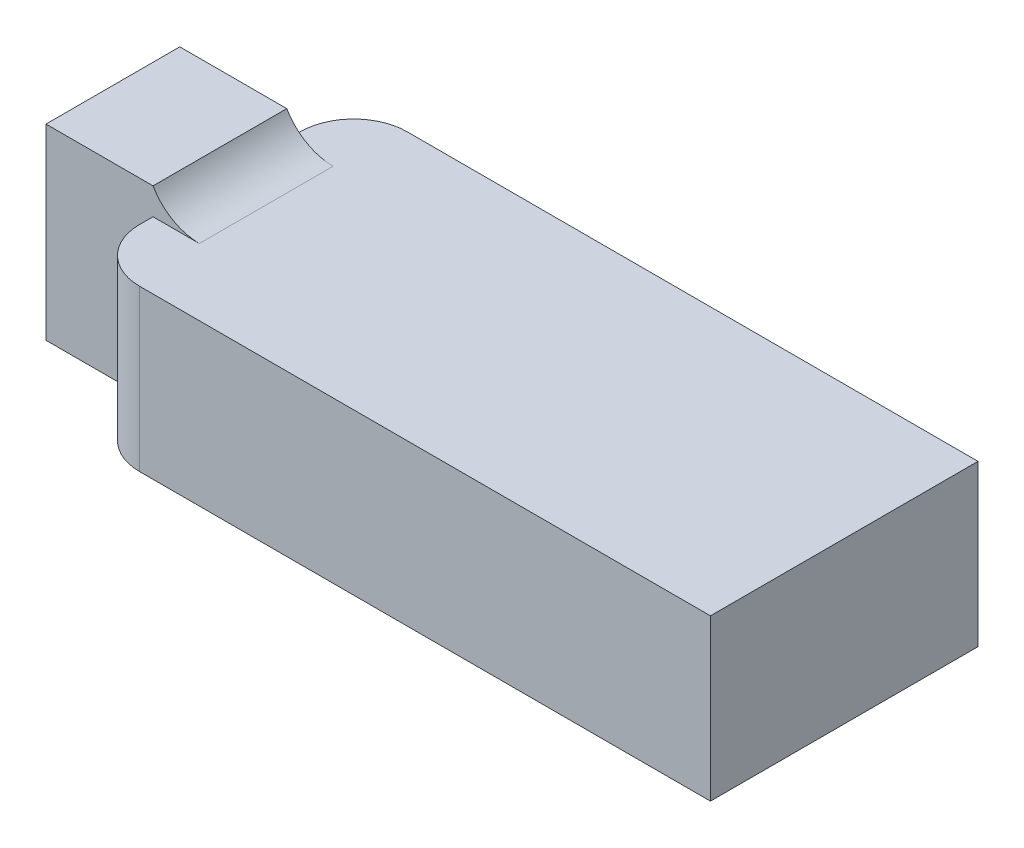
ISO-10303-21;
HEADER;
FILE_DESCRIPTION(('STEP AP214'),'2;1');
FILE_NAME('part.step','',(''),(''),'','','');
FILE_SCHEMA(('AUTOMOTIVE_DESIGN { 1 0 10303 214 1 1 1 1 }'));
ENDSEC;
DATA;
#1=APPLICATION_CONTEXT('core data for automotive mechanical design processes');
#2=APPLICATION_PROTOCOL_DEFINITION('international standard','automotive_design',2000,#1);
#3=PRODUCT_CONTEXT('',#1,'mechanical');
#4=PRODUCT('Part','Part','',(#3));
#5=PRODUCT_RELATED_PRODUCT_CATEGORY('part','',(#4));
#6=PRODUCT_DEFINITION_FORMATION('','',#4);
#7=PRODUCT_DEFINITION_CONTEXT('part definition',#1,'design');
#8=PRODUCT_DEFINITION('design','',#6,#7);
#9=PRODUCT_DEFINITION_SHAPE('','',#8);
#10=(LENGTH_UNIT() NAMED_UNIT(*) SI_UNIT(.MILLI.,.METRE.));
#11=(NAMED_UNIT(*) PLANE_ANGLE_UNIT() SI_UNIT($,.RADIAN.));
#12=(NAMED_UNIT(*) SI_UNIT($,.STERADIAN.) SOLID_ANGLE_UNIT());
#13=UNCERTAINTY_MEASURE_WITH_UNIT(LENGTH_MEASURE(1.E-05),#10,'distance_accuracy_value','');
#14=(GEOMETRIC_REPRESENTATION_CONTEXT(3) GLOBAL_UNCERTAINTY_ASSIGNED_CONTEXT((#13)) GLOBAL_UNIT_ASSIGNED_CONTEXT((#10,
#11,#12)) REPRESENTATION_CONTEXT('',''));
#15=CARTESIAN_POINT('',(0.,0.,0.));
#16=DIRECTION('',(0.,0.,1.));
#17=DIRECTION('',(1.,0.,0.));
#18=AXIS2_PLACEMENT_3D('',#15,#16,#17);
#19=CARTESIAN_POINT('',(-35.,18.,-15.));
#20=DIRECTION('',(1.,0.,0.));
#21=DIRECTION('',(0.,0.,-1.));
#22=AXIS2_PLACEMENT_3D('',#19,#20,#21);
#23=PLANE('',#22);
#24=DIRECTION('',(0.,1.,0.));
#25=VECTOR('',#24,1.);
#26=CARTESIAN_POINT('',(-35.,0.,7.5));
#27=LINE('',#26,#25);
#28=CARTESIAN_POINT('',(-35.,0.,7.5));
#29=VERTEX_POINT('',#28);
#30=CARTESIAN_POINT('',(-35.,18.,7.5));
#31=VERTEX_POINT('',#30);
#32=EDGE_CURVE('E156',#29,#31,#27,.T.);
#33=ORIENTED_EDGE('',*,*,#32,.F.);
#34=DIRECTION('',(0.,0.,1.));
#35=VECTOR('',#34,1.);
#36=CARTESIAN_POINT('',(-35.,0.,-15.));
#37=LINE('',#36,#35);
#38=CARTESIAN_POINT('',(-35.,0.,9.));
#39=VERTEX_POINT('',#38);
#40=EDGE_CURVE('E188',#29,#39,#37,.T.);
#41=ORIENTED_EDGE('',*,*,#40,.T.);
#42=DIRECTION('',(0.,-1.,0.));
#43=VECTOR('',#42,1.);
#44=CARTESIAN_POINT('',(-35.,18.,9.));
#45=LINE('',#44,#43);
#46=CARTESIAN_POINT('',(-35.,18.,9.));
#47=VERTEX_POINT('',#46);
#48=EDGE_CURVE('E208',#39,#47,#45,.F.);
#49=ORIENTED_EDGE('',*,*,#48,.T.);
#50=DIRECTION('',(0.,0.,1.));
#51=VECTOR('',#50,1.);
#52=CARTESIAN_POINT('',(-35.,18.,-15.));
#53=LINE('',#52,#51);
#54=EDGE_CURVE('E177',#31,#47,#53,.T.);
#55=ORIENTED_EDGE('',*,*,#54,.F.);
#56=EDGE_LOOP('',(#33,#41,#49,#55));
#57=FACE_BOUND('',#56,.T.);
#58=ADVANCED_FACE('F41',(#57),#23,.F.);
#59=CARTESIAN_POINT('',(35.,18.,-15.));
#60=DIRECTION('',(-1.,0.,0.));
#61=DIRECTION('',(0.,0.,1.));
#62=AXIS2_PLACEMENT_3D('',#59,#60,#61);
#63=PLANE('',#62);
#64=DIRECTION('',(0.,0.,-1.));
#65=VECTOR('',#64,1.);
#66=CARTESIAN_POINT('',(35.,0.,-15.));
#67=LINE('',#66,#65);
#68=CARTESIAN_POINT('',(35.,0.,15.));
#69=VERTEX_POINT('',#68);
#70=CARTESIAN_POINT('',(35.,0.,-15.));
#71=VERTEX_POINT('',#70);
#72=EDGE_CURVE('E139',#69,#71,#67,.T.);
#73=ORIENTED_EDGE('',*,*,#72,.T.);
#74=DIRECTION('',(0.,-1.,0.));
#75=VECTOR('',#74,1.);
#76=CARTESIAN_POINT('',(35.,18.,-15.));
#77=LINE('',#76,#75);
#78=CARTESIAN_POINT('',(35.,18.,-15.));
#79=VERTEX_POINT('',#78);
#80=EDGE_CURVE('E194',#79,#71,#77,.T.);
#81=ORIENTED_EDGE('',*,*,#80,.F.);
#82=DIRECTION('',(0.,0.,-1.));
#83=VECTOR('',#82,1.);
#84=CARTESIAN_POINT('',(35.,18.,-15.));
#85=LINE('',#84,#83);
#86=CARTESIAN_POINT('',(35.,18.,15.));
#87=VERTEX_POINT('',#86);
#88=EDGE_CURVE('E170',#87,#79,#85,.T.);
#89=ORIENTED_EDGE('',*,*,#88,.F.);
#90=DIRECTION('',(0.,-1.,0.));
#91=VECTOR('',#90,1.);
#92=CARTESIAN_POINT('',(35.,18.,15.));
#93=LINE('',#92,#91);
#94=EDGE_CURVE('E182',#87,#69,#93,.T.);
#95=ORIENTED_EDGE('',*,*,#94,.T.);
#96=EDGE_LOOP('',(#73,#81,#89,#95));
#97=FACE_BOUND('',#96,.T.);
#98=ADVANCED_FACE('F253',(#97),#63,.F.);
#99=CARTESIAN_POINT('',(-35.,18.,-15.));
#100=DIRECTION('',(0.,0.,1.));
#101=DIRECTION('',(1.,0.,0.));
#102=AXIS2_PLACEMENT_3D('',#99,#100,#101);
#103=PLANE('',#102);
#104=DIRECTION('',(-1.,0.,0.));
#105=VECTOR('',#104,1.);
#106=CARTESIAN_POINT('',(-35.,0.,-15.));
#107=LINE('',#106,#105);
#108=CARTESIAN_POINT('',(-29.,0.,-15.));
#109=VERTEX_POINT('',#108);
#110=EDGE_CURVE('E185',#71,#109,#107,.T.);
#111=ORIENTED_EDGE('',*,*,#110,.T.);
#112=DIRECTION('',(0.,-1.,0.));
#113=VECTOR('',#112,1.);
#114=CARTESIAN_POINT('',(-29.,18.,-15.));
#115=LINE('',#114,#113);
#116=CARTESIAN_POINT('',(-29.,18.,-15.));
#117=VERTEX_POINT('',#116);
#118=EDGE_CURVE('E215',#109,#117,#115,.F.);
#119=ORIENTED_EDGE('',*,*,#118,.T.);
#120=DIRECTION('',(-1.,0.,0.));
#121=VECTOR('',#120,1.);
#122=CARTESIAN_POINT('',(-35.,18.,-15.));
#123=LINE('',#122,#121);
#124=EDGE_CURVE('E173',#79,#117,#123,.T.);
#125=ORIENTED_EDGE('',*,*,#124,.F.);
#126=ORIENTED_EDGE('',*,*,#80,.T.);
#127=EDGE_LOOP('',(#111,#119,#125,#126));
#128=FACE_BOUND('',#127,.T.);
#129=ADVANCED_FACE('F240',(#128),#103,.F.);
#130=CARTESIAN_POINT('',(-35.,0.,-9.));
#131=VERTEX_POINT('',#130);
#132=CARTESIAN_POINT('',(-35.,0.,-7.5));
#133=VERTEX_POINT('',#132);
#134=EDGE_CURVE('E189',#131,#133,#37,.T.);
#135=ORIENTED_EDGE('',*,*,#134,.T.);
#136=DIRECTION('',(0.,1.,0.));
#137=VECTOR('',#136,1.);
#138=CARTESIAN_POINT('',(-35.,0.,-7.5));
#139=LINE('',#138,#137);
#140=CARTESIAN_POINT('',(-35.,18.,-7.5));
#141=VERTEX_POINT('',#140);
#142=EDGE_CURVE('E136',#133,#141,#139,.T.);
#143=ORIENTED_EDGE('',*,*,#142,.T.);
#144=CARTESIAN_POINT('',(-35.,18.,-9.));
#145=VERTEX_POINT('',#144);
#146=EDGE_CURVE('E178',#145,#141,#53,.T.);
#147=ORIENTED_EDGE('',*,*,#146,.F.);
#148=DIRECTION('',(0.,-1.,0.));
#149=VECTOR('',#148,1.);
#150=CARTESIAN_POINT('',(-35.,18.,-9.));
#151=LINE('',#150,#149);
#152=EDGE_CURVE('E205',#145,#131,#151,.T.);
#153=ORIENTED_EDGE('',*,*,#152,.T.);
#154=EDGE_LOOP('',(#135,#143,#147,#153));
#155=FACE_BOUND('',#154,.T.);
#156=ADVANCED_FACE('F235',(#155),#23,.F.);
#157=CARTESIAN_POINT('',(-35.,18.,15.));
#158=DIRECTION('',(0.,0.,-1.));
#159=DIRECTION('',(-1.,0.,0.));
#160=AXIS2_PLACEMENT_3D('',#157,#158,#159);
#161=PLANE('',#160);
#162=DIRECTION('',(1.,0.,0.));
#163=VECTOR('',#162,1.);
#164=CARTESIAN_POINT('',(-35.,18.,15.));
#165=LINE('',#164,#163);
#166=CARTESIAN_POINT('',(-29.,18.,15.));
#167=VERTEX_POINT('',#166);
#168=EDGE_CURVE('E180',#167,#87,#165,.T.);
#169=ORIENTED_EDGE('',*,*,#168,.F.);
#170=DIRECTION('',(0.,-1.,0.));
#171=VECTOR('',#170,1.);
#172=CARTESIAN_POINT('',(-29.,18.,15.));
#173=LINE('',#172,#171);
#174=CARTESIAN_POINT('',(-29.,0.,15.));
#175=VERTEX_POINT('',#174);
#176=EDGE_CURVE('E197',#167,#175,#173,.T.);
#177=ORIENTED_EDGE('',*,*,#176,.T.);
#178=DIRECTION('',(1.,0.,0.));
#179=VECTOR('',#178,1.);
#180=CARTESIAN_POINT('',(-35.,0.,15.));
#181=LINE('',#180,#179);
#182=EDGE_CURVE('E174',#175,#69,#181,.T.);
#183=ORIENTED_EDGE('',*,*,#182,.T.);
#184=ORIENTED_EDGE('',*,*,#94,.F.);
#185=EDGE_LOOP('',(#169,#177,#183,#184));
#186=FACE_BOUND('',#185,.T.);
#187=ADVANCED_FACE('F265',(#186),#161,.F.);
#188=CARTESIAN_POINT('',(0.,18.,0.));
#189=DIRECTION('',(0.,1.,0.));
#190=DIRECTION('',(0.,0.,1.));
#191=AXIS2_PLACEMENT_3D('',#188,#189,#190);
#192=PLANE('',#191);
#193=DIRECTION('',(0.,0.,1.));
#194=VECTOR('',#193,1.);
#195=CARTESIAN_POINT('',(-29.8038475772934,18.,7.49999999999999));
#196=LINE('',#195,#194);
#197=CARTESIAN_POINT('',(-29.8038475772934,18.,-7.50000000000001));
#198=VERTEX_POINT('',#197);
#199=CARTESIAN_POINT('',(-29.8038475772934,18.,7.5));
#200=VERTEX_POINT('',#199);
#201=EDGE_CURVE('E218',#198,#200,#196,.T.);
#202=ORIENTED_EDGE('',*,*,#201,.T.);
#203=DIRECTION('',(-1.,0.,0.));
#204=VECTOR('',#203,1.);
#205=CARTESIAN_POINT('',(0.,18.,7.49999999999999));
#206=LINE('',#205,#204);
#207=EDGE_CURVE('E221',#200,#31,#206,.T.);
#208=ORIENTED_EDGE('',*,*,#207,.T.);
#209=ORIENTED_EDGE('',*,*,#54,.T.);
#210=CARTESIAN_POINT('',(-29.,18.,9.));
#211=DIRECTION('',(0.,1.,0.));
#212=DIRECTION('',(0.,0.,1.));
#213=AXIS2_PLACEMENT_3D('',#210,#211,#212);
#214=CIRCLE('',#213,6.);
#215=EDGE_CURVE('E213',#47,#167,#214,.T.);
#216=ORIENTED_EDGE('',*,*,#215,.T.);
#217=ORIENTED_EDGE('',*,*,#168,.T.);
#218=ORIENTED_EDGE('',*,*,#88,.T.);
#219=ORIENTED_EDGE('',*,*,#124,.T.);
#220=CARTESIAN_POINT('',(-29.,18.,-9.));
#221=DIRECTION('',(0.,1.,0.));
#222=DIRECTION('',(0.,0.,1.));
#223=AXIS2_PLACEMENT_3D('',#220,#221,#222);
#224=CIRCLE('',#223,6.);
#225=EDGE_CURVE('E211',#117,#145,#224,.T.);
#226=ORIENTED_EDGE('',*,*,#225,.T.);
#227=ORIENTED_EDGE('',*,*,#146,.T.);
#228=DIRECTION('',(1.,0.,0.));
#229=VECTOR('',#228,1.);
#230=CARTESIAN_POINT('',(-47.,18.,-7.5));
#231=LINE('',#230,#229);
#232=EDGE_CURVE('E55',#141,#198,#231,.T.);
#233=ORIENTED_EDGE('',*,*,#232,.T.);
#234=EDGE_LOOP('',(#202,#208,#209,#216,#217,#218,#219,#226,#227,#233));
#235=FACE_BOUND('',#234,.T.);
#236=ADVANCED_FACE('F230',(#235),#192,.T.);
#237=CARTESIAN_POINT('',(0.,0.,0.));
#238=DIRECTION('',(0.,1.,0.));
#239=DIRECTION('',(0.,0.,1.));
#240=AXIS2_PLACEMENT_3D('',#237,#238,#239);
#241=PLANE('',#240);
#242=ORIENTED_EDGE('',*,*,#182,.F.);
#243=CARTESIAN_POINT('',(-29.,0.,9.));
#244=DIRECTION('',(0.,1.,0.));
#245=DIRECTION('',(0.,0.,1.));
#246=AXIS2_PLACEMENT_3D('',#243,#244,#245);
#247=CIRCLE('',#246,6.);
#248=EDGE_CURVE('E202',#175,#39,#247,.F.);
#249=ORIENTED_EDGE('',*,*,#248,.T.);
#250=ORIENTED_EDGE('',*,*,#40,.F.);
#251=DIRECTION('',(1.,0.,0.));
#252=VECTOR('',#251,1.);
#253=CARTESIAN_POINT('',(-47.,0.,7.5));
#254=LINE('',#253,#252);
#255=CARTESIAN_POINT('',(-47.,0.,7.5));
#256=VERTEX_POINT('',#255);
#257=EDGE_CURVE('E140',#256,#29,#254,.T.);
#258=ORIENTED_EDGE('',*,*,#257,.F.);
#259=DIRECTION('',(0.,0.,1.));
#260=VECTOR('',#259,1.);
#261=CARTESIAN_POINT('',(-47.,0.,0.));
#262=LINE('',#261,#260);
#263=CARTESIAN_POINT('',(-47.,0.,-7.5));
#264=VERTEX_POINT('',#263);
#265=EDGE_CURVE('E143',#264,#256,#262,.T.);
#266=ORIENTED_EDGE('',*,*,#265,.F.);
#267=DIRECTION('',(1.,0.,0.));
#268=VECTOR('',#267,1.);
#269=CARTESIAN_POINT('',(-47.,0.,-7.5));
#270=LINE('',#269,#268);
#271=EDGE_CURVE('E129',#264,#133,#270,.T.);
#272=ORIENTED_EDGE('',*,*,#271,.T.);
#273=ORIENTED_EDGE('',*,*,#134,.F.);
#274=CARTESIAN_POINT('',(-29.,0.,-9.));
#275=DIRECTION('',(0.,1.,0.));
#276=DIRECTION('',(0.,0.,1.));
#277=AXIS2_PLACEMENT_3D('',#274,#275,#276);
#278=CIRCLE('',#277,6.);
#279=EDGE_CURVE('E200',#131,#109,#278,.F.);
#280=ORIENTED_EDGE('',*,*,#279,.T.);
#281=ORIENTED_EDGE('',*,*,#110,.F.);
#282=ORIENTED_EDGE('',*,*,#72,.F.);
#283=EDGE_LOOP('',(#242,#249,#250,#258,#266,#272,#273,#280,#281,#282));
#284=FACE_BOUND('',#283,.T.);
#285=ADVANCED_FACE('F145',(#284),#241,.F.);
#286=CARTESIAN_POINT('',(-29.,18.,9.));
#287=DIRECTION('',(0.,-1.,0.));
#288=DIRECTION('',(0.,0.,-1.));
#289=AXIS2_PLACEMENT_3D('',#286,#287,#288);
#290=CYLINDRICAL_SURFACE('',#289,6.);
#291=ORIENTED_EDGE('',*,*,#215,.F.);
#292=ORIENTED_EDGE('',*,*,#48,.F.);
#293=ORIENTED_EDGE('',*,*,#248,.F.);
#294=ORIENTED_EDGE('',*,*,#176,.F.);
#295=EDGE_LOOP('',(#291,#292,#293,#294));
#296=FACE_BOUND('',#295,.T.);
#297=ADVANCED_FACE('F244',(#296),#290,.T.);
#298=CARTESIAN_POINT('',(-29.,18.,-9.));
#299=DIRECTION('',(0.,-1.,0.));
#300=DIRECTION('',(0.,0.,-1.));
#301=AXIS2_PLACEMENT_3D('',#298,#299,#300);
#302=CYLINDRICAL_SURFACE('',#301,6.);
#303=ORIENTED_EDGE('',*,*,#225,.F.);
#304=ORIENTED_EDGE('',*,*,#118,.F.);
#305=ORIENTED_EDGE('',*,*,#279,.F.);
#306=ORIENTED_EDGE('',*,*,#152,.F.);
#307=EDGE_LOOP('',(#303,#304,#305,#306));
#308=FACE_BOUND('',#307,.T.);
#309=ADVANCED_FACE('F242',(#308),#302,.T.);
#310=CARTESIAN_POINT('',(-47.,0.,-7.5));
#311=DIRECTION('',(0.,0.,-1.));
#312=DIRECTION('',(-1.,0.,0.));
#313=AXIS2_PLACEMENT_3D('',#310,#311,#312);
#314=PLANE('',#313);
#315=ORIENTED_EDGE('',*,*,#142,.F.);
#316=ORIENTED_EDGE('',*,*,#271,.F.);
#317=DIRECTION('',(0.,1.,0.));
#318=VECTOR('',#317,1.);
#319=CARTESIAN_POINT('',(-47.,0.,-7.5));
#320=LINE('',#319,#318);
#321=CARTESIAN_POINT('',(-47.,21.,-7.5));
#322=VERTEX_POINT('',#321);
#323=EDGE_CURVE('E133',#264,#322,#320,.T.);
#324=ORIENTED_EDGE('',*,*,#323,.T.);
#325=DIRECTION('',(1.,0.,0.));
#326=VECTOR('',#325,1.);
#327=CARTESIAN_POINT('',(-47.,21.,-7.5));
#328=LINE('',#327,#326);
#329=CARTESIAN_POINT('',(-35.,21.,-7.5));
#330=VERTEX_POINT('',#329);
#331=EDGE_CURVE('E161',#322,#330,#328,.T.);
#332=ORIENTED_EDGE('',*,*,#331,.T.);
#333=CARTESIAN_POINT('',(-29.8038475772934,24.,-7.50000000000001));
#334=DIRECTION('',(0.,0.,-1.));
#335=DIRECTION('',(-1.,0.,0.));
#336=AXIS2_PLACEMENT_3D('',#333,#334,#335);
#337=CIRCLE('',#336,6.);
#338=EDGE_CURVE('E11',#330,#198,#337,.F.);
#339=ORIENTED_EDGE('',*,*,#338,.T.);
#340=ORIENTED_EDGE('',*,*,#232,.F.);
#341=EDGE_LOOP('',(#315,#316,#324,#332,#339,#340));
#342=FACE_BOUND('',#341,.T.);
#343=ADVANCED_FACE('F131',(#342),#314,.T.);
#344=CARTESIAN_POINT('',(-47.,0.,7.5));
#345=DIRECTION('',(0.,0.,-1.));
#346=DIRECTION('',(-1.,0.,0.));
#347=AXIS2_PLACEMENT_3D('',#344,#345,#346);
#348=PLANE('',#347);
#349=ORIENTED_EDGE('',*,*,#32,.T.);
#350=ORIENTED_EDGE('',*,*,#207,.F.);
#351=CARTESIAN_POINT('',(-29.8038475772934,24.,7.5));
#352=DIRECTION('',(0.,0.,-1.));
#353=DIRECTION('',(-1.,0.,0.));
#354=AXIS2_PLACEMENT_3D('',#351,#352,#353);
#355=CIRCLE('',#354,6.);
#356=CARTESIAN_POINT('',(-35.,21.,7.5));
#357=VERTEX_POINT('',#356);
#358=EDGE_CURVE('E49',#200,#357,#355,.T.);
#359=ORIENTED_EDGE('',*,*,#358,.T.);
#360=DIRECTION('',(1.,0.,0.));
#361=VECTOR('',#360,1.);
#362=CARTESIAN_POINT('',(-47.,21.,7.5));
#363=LINE('',#362,#361);
#364=CARTESIAN_POINT('',(-47.,21.,7.5));
#365=VERTEX_POINT('',#364);
#366=EDGE_CURVE('E166',#365,#357,#363,.T.);
#367=ORIENTED_EDGE('',*,*,#366,.F.);
#368=DIRECTION('',(0.,1.,0.));
#369=VECTOR('',#368,1.);
#370=CARTESIAN_POINT('',(-47.,0.,7.5));
#371=LINE('',#370,#369);
#372=EDGE_CURVE('E149',#256,#365,#371,.T.);
#373=ORIENTED_EDGE('',*,*,#372,.F.);
#374=ORIENTED_EDGE('',*,*,#257,.T.);
#375=EDGE_LOOP('',(#349,#350,#359,#367,#373,#374));
#376=FACE_BOUND('',#375,.T.);
#377=ADVANCED_FACE('F224',(#376),#348,.F.);
#378=CARTESIAN_POINT('',(-47.,21.,0.));
#379=DIRECTION('',(0.,1.,0.));
#380=DIRECTION('',(0.,0.,1.));
#381=AXIS2_PLACEMENT_3D('',#378,#379,#380);
#382=PLANE('',#381);
#383=DIRECTION('',(0.,0.,1.));
#384=VECTOR('',#383,1.);
#385=CARTESIAN_POINT('',(-35.,21.,0.));
#386=LINE('',#385,#384);
#387=EDGE_CURVE('E154',#330,#357,#386,.T.);
#388=ORIENTED_EDGE('',*,*,#387,.F.);
#389=ORIENTED_EDGE('',*,*,#331,.F.);
#390=DIRECTION('',(0.,0.,1.));
#391=VECTOR('',#390,1.);
#392=CARTESIAN_POINT('',(-47.,21.,0.));
#393=LINE('',#392,#391);
#394=EDGE_CURVE('E153',#322,#365,#393,.T.);
#395=ORIENTED_EDGE('',*,*,#394,.T.);
#396=ORIENTED_EDGE('',*,*,#366,.T.);
#397=EDGE_LOOP('',(#388,#389,#395,#396));
#398=FACE_BOUND('',#397,.T.);
#399=ADVANCED_FACE('F227',(#398),#382,.T.);
#400=CARTESIAN_POINT('',(-47.,0.,0.));
#401=DIRECTION('',(-1.,0.,0.));
#402=DIRECTION('',(0.,0.,1.));
#403=AXIS2_PLACEMENT_3D('',#400,#401,#402);
#404=PLANE('',#403);
#405=ORIENTED_EDGE('',*,*,#323,.F.);
#406=ORIENTED_EDGE('',*,*,#265,.T.);
#407=ORIENTED_EDGE('',*,*,#372,.T.);
#408=ORIENTED_EDGE('',*,*,#394,.F.);
#409=EDGE_LOOP('',(#405,#406,#407,#408));
#410=FACE_BOUND('',#409,.T.);
#411=ADVANCED_FACE('F151',(#410),#404,.T.);
#412=CARTESIAN_POINT('',(-29.8038475772934,24.,0.));
#413=DIRECTION('',(0.,0.,-1.));
#414=DIRECTION('',(-1.,0.,0.));
#415=AXIS2_PLACEMENT_3D('',#412,#413,#414);
#416=CYLINDRICAL_SURFACE('',#415,6.);
#417=ORIENTED_EDGE('',*,*,#338,.F.);
#418=ORIENTED_EDGE('',*,*,#387,.T.);
#419=ORIENTED_EDGE('',*,*,#358,.F.);
#420=ORIENTED_EDGE('',*,*,#201,.F.);
#421=EDGE_LOOP('',(#417,#418,#419,#420));
#422=FACE_BOUND('',#421,.T.);
#423=ADVANCED_FACE('F43',(#422),#416,.F.);
#424=CLOSED_SHELL('',(#58,#98,#129,#156,#187,#236,#285,#297,#309,#343,#377,#399,#411,#423));
#425=MANIFOLD_SOLID_BREP('B2',#424);
#426=ADVANCED_BREP_SHAPE_REPRESENTATION('',(#18,#425),#14);
#427=SHAPE_DEFINITION_REPRESENTATION(#9,#426);
ENDSEC;
END-ISO-10303-21;
